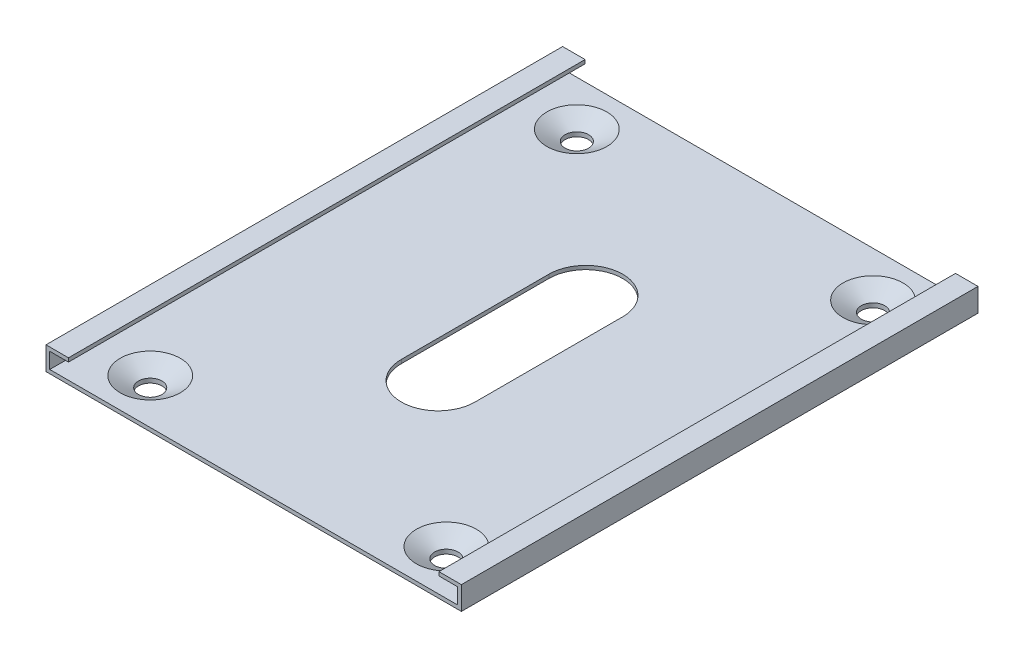
ISO-10303-21;
HEADER;
FILE_DESCRIPTION(('STEP AP214'),'2;1');
FILE_NAME('part.step','',(''),(''),'','','');
FILE_SCHEMA(('AUTOMOTIVE_DESIGN { 1 0 10303 214 1 1 1 1 }'));
ENDSEC;
DATA;
#1=APPLICATION_CONTEXT('core data for automotive mechanical design processes');
#2=APPLICATION_PROTOCOL_DEFINITION('international standard','automotive_design',2000,#1);
#3=PRODUCT_CONTEXT('',#1,'mechanical');
#4=PRODUCT('Part','Part','',(#3));
#5=PRODUCT_RELATED_PRODUCT_CATEGORY('part','',(#4));
#6=PRODUCT_DEFINITION_FORMATION('','',#4);
#7=PRODUCT_DEFINITION_CONTEXT('part definition',#1,'design');
#8=PRODUCT_DEFINITION('design','',#6,#7);
#9=PRODUCT_DEFINITION_SHAPE('','',#8);
#10=(LENGTH_UNIT() NAMED_UNIT(*) SI_UNIT(.MILLI.,.METRE.));
#11=(NAMED_UNIT(*) PLANE_ANGLE_UNIT() SI_UNIT($,.RADIAN.));
#12=(NAMED_UNIT(*) SI_UNIT($,.STERADIAN.) SOLID_ANGLE_UNIT());
#13=UNCERTAINTY_MEASURE_WITH_UNIT(LENGTH_MEASURE(1.E-05),#10,'distance_accuracy_value','');
#14=(GEOMETRIC_REPRESENTATION_CONTEXT(3) GLOBAL_UNCERTAINTY_ASSIGNED_CONTEXT((#13)) GLOBAL_UNIT_ASSIGNED_CONTEXT((#10,
#11,#12)) REPRESENTATION_CONTEXT('',''));
#15=CARTESIAN_POINT('',(0.,0.,0.));
#16=DIRECTION('',(0.,0.,1.));
#17=DIRECTION('',(1.,0.,0.));
#18=AXIS2_PLACEMENT_3D('',#15,#16,#17);
#19=CARTESIAN_POINT('',(-27.6352,2.13359999999999,70.));
#20=DIRECTION('',(0.,1.,0.));
#21=DIRECTION('',(0.,0.,1.));
#22=AXIS2_PLACEMENT_3D('',#19,#20,#21);
#23=PLANE('',#22);
#24=DIRECTION('',(1.,0.,0.));
#25=VECTOR('',#24,1.);
#26=CARTESIAN_POINT('',(-27.6352,2.13359999999999,0.));
#27=LINE('',#26,#25);
#28=CARTESIAN_POINT('',(-27.6352,2.13359999999999,0.));
#29=VERTEX_POINT('',#28);
#30=CARTESIAN_POINT('',(-25.0952,2.13359999999999,0.));
#31=VERTEX_POINT('',#30);
#32=EDGE_CURVE('E172',#29,#31,#27,.T.);
#33=ORIENTED_EDGE('',*,*,#32,.T.);
#34=DIRECTION('',(0.,0.,-1.));
#35=VECTOR('',#34,1.);
#36=CARTESIAN_POINT('',(-25.0952,2.13359999999999,70.));
#37=LINE('',#36,#35);
#38=CARTESIAN_POINT('',(-25.0952,2.13359999999999,70.));
#39=VERTEX_POINT('',#38);
#40=EDGE_CURVE('E229',#39,#31,#37,.T.);
#41=ORIENTED_EDGE('',*,*,#40,.F.);
#42=DIRECTION('',(1.,0.,0.));
#43=VECTOR('',#42,1.);
#44=CARTESIAN_POINT('',(-27.6352,2.13359999999999,70.));
#45=LINE('',#44,#43);
#46=CARTESIAN_POINT('',(-27.6352,2.13359999999999,70.));
#47=VERTEX_POINT('',#46);
#48=EDGE_CURVE('E167',#47,#39,#45,.T.);
#49=ORIENTED_EDGE('',*,*,#48,.F.);
#50=DIRECTION('',(0.,0.,-1.));
#51=VECTOR('',#50,1.);
#52=CARTESIAN_POINT('',(-27.6352,2.13359999999999,70.));
#53=LINE('',#52,#51);
#54=EDGE_CURVE('E162',#47,#29,#53,.T.);
#55=ORIENTED_EDGE('',*,*,#54,.T.);
#56=EDGE_LOOP('',(#33,#41,#49,#55));
#57=FACE_BOUND('',#56,.T.);
#58=ADVANCED_FACE('F33',(#57),#23,.F.);
#59=CARTESIAN_POINT('',(-25.0952,2.64159999999999,70.));
#60=DIRECTION('',(1.,0.,0.));
#61=DIRECTION('',(0.,0.,-1.));
#62=AXIS2_PLACEMENT_3D('',#59,#60,#61);
#63=PLANE('',#62);
#64=DIRECTION('',(0.,-1.,0.));
#65=VECTOR('',#64,1.);
#66=CARTESIAN_POINT('',(-25.0952,2.64159999999999,0.));
#67=LINE('',#66,#65);
#68=CARTESIAN_POINT('',(-25.0952,2.64159999999999,0.));
#69=VERTEX_POINT('',#68);
#70=EDGE_CURVE('E179',#69,#31,#67,.T.);
#71=ORIENTED_EDGE('',*,*,#70,.F.);
#72=DIRECTION('',(0.,0.,-1.));
#73=VECTOR('',#72,1.);
#74=CARTESIAN_POINT('',(-25.0952,2.64159999999999,70.));
#75=LINE('',#74,#73);
#76=CARTESIAN_POINT('',(-25.0952,2.64159999999999,70.));
#77=VERTEX_POINT('',#76);
#78=EDGE_CURVE('E227',#77,#69,#75,.T.);
#79=ORIENTED_EDGE('',*,*,#78,.F.);
#80=DIRECTION('',(0.,-1.,0.));
#81=VECTOR('',#80,1.);
#82=CARTESIAN_POINT('',(-25.0952,2.64159999999999,70.));
#83=LINE('',#82,#81);
#84=EDGE_CURVE('E290',#77,#39,#83,.T.);
#85=ORIENTED_EDGE('',*,*,#84,.T.);
#86=ORIENTED_EDGE('',*,*,#40,.T.);
#87=EDGE_LOOP('',(#71,#79,#85,#86));
#88=FACE_BOUND('',#87,.T.);
#89=ADVANCED_FACE('F321',(#88),#63,.T.);
#90=CARTESIAN_POINT('',(-27.6352,2.64159999999999,70.));
#91=DIRECTION('',(0.,1.,0.));
#92=DIRECTION('',(0.,0.,1.));
#93=AXIS2_PLACEMENT_3D('',#90,#91,#92);
#94=PLANE('',#93);
#95=DIRECTION('',(1.,0.,0.));
#96=VECTOR('',#95,1.);
#97=CARTESIAN_POINT('',(-27.6352,2.64159999999999,0.));
#98=LINE('',#97,#96);
#99=CARTESIAN_POINT('',(-28.1432,2.64159999999999,0.));
#100=VERTEX_POINT('',#99);
#101=EDGE_CURVE('E182',#100,#69,#98,.T.);
#102=ORIENTED_EDGE('',*,*,#101,.F.);
#103=DIRECTION('',(0.,0.,-1.));
#104=VECTOR('',#103,1.);
#105=CARTESIAN_POINT('',(-28.1432,2.64159999999999,70.));
#106=LINE('',#105,#104);
#107=CARTESIAN_POINT('',(-28.1432,2.64159999999999,70.));
#108=VERTEX_POINT('',#107);
#109=EDGE_CURVE('E225',#108,#100,#106,.T.);
#110=ORIENTED_EDGE('',*,*,#109,.F.);
#111=DIRECTION('',(1.,0.,0.));
#112=VECTOR('',#111,1.);
#113=CARTESIAN_POINT('',(-27.6352,2.64159999999999,70.));
#114=LINE('',#113,#112);
#115=EDGE_CURVE('E293',#108,#77,#114,.T.);
#116=ORIENTED_EDGE('',*,*,#115,.T.);
#117=ORIENTED_EDGE('',*,*,#78,.T.);
#118=EDGE_LOOP('',(#102,#110,#116,#117));
#119=FACE_BOUND('',#118,.T.);
#120=ADVANCED_FACE('F324',(#119),#94,.T.);
#121=CARTESIAN_POINT('',(-28.1432,0.,70.));
#122=DIRECTION('',(-1.,0.,0.));
#123=DIRECTION('',(0.,0.,1.));
#124=AXIS2_PLACEMENT_3D('',#121,#122,#123);
#125=PLANE('',#124);
#126=DIRECTION('',(0.,1.,0.));
#127=VECTOR('',#126,1.);
#128=CARTESIAN_POINT('',(-28.1432,0.,0.));
#129=LINE('',#128,#127);
#130=CARTESIAN_POINT('',(-28.1432,-0.508,0.));
#131=VERTEX_POINT('',#130);
#132=EDGE_CURVE('E189',#131,#100,#129,.T.);
#133=ORIENTED_EDGE('',*,*,#132,.F.);
#134=DIRECTION('',(0.,0.,-1.));
#135=VECTOR('',#134,1.);
#136=CARTESIAN_POINT('',(-28.1432,-0.508,70.));
#137=LINE('',#136,#135);
#138=CARTESIAN_POINT('',(-28.1432,-0.508,70.));
#139=VERTEX_POINT('',#138);
#140=EDGE_CURVE('E223',#139,#131,#137,.T.);
#141=ORIENTED_EDGE('',*,*,#140,.F.);
#142=DIRECTION('',(0.,1.,0.));
#143=VECTOR('',#142,1.);
#144=CARTESIAN_POINT('',(-28.1432,0.,70.));
#145=LINE('',#144,#143);
#146=EDGE_CURVE('E296',#139,#108,#145,.T.);
#147=ORIENTED_EDGE('',*,*,#146,.T.);
#148=ORIENTED_EDGE('',*,*,#109,.T.);
#149=EDGE_LOOP('',(#133,#141,#147,#148));
#150=FACE_BOUND('',#149,.T.);
#151=ADVANCED_FACE('F329',(#150),#125,.T.);
#152=CARTESIAN_POINT('',(27.6352,-0.508,70.));
#153=DIRECTION('',(0.,-1.,0.));
#154=DIRECTION('',(0.,0.,-1.));
#155=AXIS2_PLACEMENT_3D('',#152,#153,#154);
#156=PLANE('',#155);
#157=CARTESIAN_POINT('',(-20.1168,-0.508,6.09599999999999));
#158=DIRECTION('',(0.,-1.,0.));
#159=DIRECTION('',(0.,0.,-1.));
#160=AXIS2_PLACEMENT_3D('',#157,#158,#159);
#161=CIRCLE('',#160,4.20011818975501);
#162=CARTESIAN_POINT('',(-20.1168,-0.508,1.89588181024498));
#163=VERTEX_POINT('',#162);
#164=EDGE_CURVE('E521',#163,#163,#161,.F.);
#165=ORIENTED_EDGE('',*,*,#164,.T.);
#166=EDGE_LOOP('',(#165));
#167=FACE_BOUND('',#166,.T.);
#168=CARTESIAN_POINT('',(20.0152,-0.508,6.09599999999999));
#169=DIRECTION('',(0.,-1.,0.));
#170=DIRECTION('',(0.,0.,-1.));
#171=AXIS2_PLACEMENT_3D('',#168,#169,#170);
#172=CIRCLE('',#171,4.20011818975501);
#173=CARTESIAN_POINT('',(20.0152,-0.508,1.89588181024498));
#174=VERTEX_POINT('',#173);
#175=EDGE_CURVE('E246',#174,#174,#172,.F.);
#176=ORIENTED_EDGE('',*,*,#175,.T.);
#177=EDGE_LOOP('',(#176));
#178=FACE_BOUND('',#177,.T.);
#179=CARTESIAN_POINT('',(-20.1168,-0.508,63.904));
#180=DIRECTION('',(0.,-1.,0.));
#181=DIRECTION('',(0.,0.,-1.));
#182=AXIS2_PLACEMENT_3D('',#179,#180,#181);
#183=CIRCLE('',#182,4.20011818975501);
#184=CARTESIAN_POINT('',(-20.1168,-0.508,59.703881810245));
#185=VERTEX_POINT('',#184);
#186=EDGE_CURVE('E269',#185,#185,#183,.F.);
#187=ORIENTED_EDGE('',*,*,#186,.T.);
#188=EDGE_LOOP('',(#187));
#189=FACE_BOUND('',#188,.T.);
#190=CARTESIAN_POINT('',(20.0152,-0.508,63.904));
#191=DIRECTION('',(0.,-1.,0.));
#192=DIRECTION('',(0.,0.,-1.));
#193=AXIS2_PLACEMENT_3D('',#190,#191,#192);
#194=CIRCLE('',#193,4.20011818975501);
#195=CARTESIAN_POINT('',(20.0152,-0.508,59.703881810245));
#196=VERTEX_POINT('',#195);
#197=EDGE_CURVE('E281',#196,#196,#194,.F.);
#198=ORIENTED_EDGE('',*,*,#197,.T.);
#199=EDGE_LOOP('',(#198));
#200=FACE_BOUND('',#199,.T.);
#201=CARTESIAN_POINT('',(0.,-0.508,45.));
#202=DIRECTION('',(0.,-1.,0.));
#203=DIRECTION('',(0.,0.,-1.));
#204=AXIS2_PLACEMENT_3D('',#201,#202,#203);
#205=CIRCLE('',#204,5.);
#206=CARTESIAN_POINT('',(4.99999999999999,-0.508,45.));
#207=VERTEX_POINT('',#206);
#208=CARTESIAN_POINT('',(-5.,-0.508,45.));
#209=VERTEX_POINT('',#208);
#210=EDGE_CURVE('E180',#207,#209,#205,.T.);
#211=ORIENTED_EDGE('',*,*,#210,.F.);
#212=DIRECTION('',(0.,0.,-1.));
#213=VECTOR('',#212,1.);
#214=CARTESIAN_POINT('',(4.99999999999999,-0.508,45.));
#215=LINE('',#214,#213);
#216=CARTESIAN_POINT('',(5.00000000000001,-0.508,25.));
#217=VERTEX_POINT('',#216);
#218=EDGE_CURVE('E78',#217,#207,#215,.F.);
#219=ORIENTED_EDGE('',*,*,#218,.F.);
#220=CARTESIAN_POINT('',(0.,-0.508,25.));
#221=DIRECTION('',(0.,-1.,0.));
#222=DIRECTION('',(0.,0.,-1.));
#223=AXIS2_PLACEMENT_3D('',#220,#221,#222);
#224=CIRCLE('',#223,5.);
#225=CARTESIAN_POINT('',(-4.99999999999999,-0.508,25.));
#226=VERTEX_POINT('',#225);
#227=EDGE_CURVE('E241',#226,#217,#224,.T.);
#228=ORIENTED_EDGE('',*,*,#227,.F.);
#229=DIRECTION('',(0.,0.,1.));
#230=VECTOR('',#229,1.);
#231=CARTESIAN_POINT('',(-5.,-0.508,45.));
#232=LINE('',#231,#230);
#233=EDGE_CURVE('E239',#209,#226,#232,.F.);
#234=ORIENTED_EDGE('',*,*,#233,.F.);
#235=EDGE_LOOP('',(#211,#219,#228,#234));
#236=FACE_BOUND('',#235,.T.);
#237=DIRECTION('',(1.,0.,0.));
#238=VECTOR('',#237,1.);
#239=CARTESIAN_POINT('',(27.6352,-0.508,0.));
#240=LINE('',#239,#238);
#241=CARTESIAN_POINT('',(28.1432,-0.508,0.));
#242=VERTEX_POINT('',#241);
#243=EDGE_CURVE('E192',#242,#131,#240,.F.);
#244=ORIENTED_EDGE('',*,*,#243,.F.);
#245=DIRECTION('',(0.,0.,-1.));
#246=VECTOR('',#245,1.);
#247=CARTESIAN_POINT('',(28.1432,-0.508,70.));
#248=LINE('',#247,#246);
#249=CARTESIAN_POINT('',(28.1432,-0.508,70.));
#250=VERTEX_POINT('',#249);
#251=EDGE_CURVE('E221',#250,#242,#248,.T.);
#252=ORIENTED_EDGE('',*,*,#251,.F.);
#253=DIRECTION('',(1.,0.,0.));
#254=VECTOR('',#253,1.);
#255=CARTESIAN_POINT('',(27.6352,-0.508,70.));
#256=LINE('',#255,#254);
#257=EDGE_CURVE('E299',#250,#139,#256,.F.);
#258=ORIENTED_EDGE('',*,*,#257,.T.);
#259=ORIENTED_EDGE('',*,*,#140,.T.);
#260=EDGE_LOOP('',(#244,#252,#258,#259));
#261=FACE_BOUND('',#260,.T.);
#262=ADVANCED_FACE('F332',(#167,#178,#189,#200,#236,#261),#156,.T.);
#263=CARTESIAN_POINT('',(28.1432,0.,70.));
#264=DIRECTION('',(1.,0.,0.));
#265=DIRECTION('',(0.,0.,-1.));
#266=AXIS2_PLACEMENT_3D('',#263,#264,#265);
#267=PLANE('',#266);
#268=DIRECTION('',(0.,1.,0.));
#269=VECTOR('',#268,1.);
#270=CARTESIAN_POINT('',(28.1432,0.,0.));
#271=LINE('',#270,#269);
#272=CARTESIAN_POINT('',(28.1432,2.64159999999999,0.));
#273=VERTEX_POINT('',#272);
#274=EDGE_CURVE('E195',#273,#242,#271,.F.);
#275=ORIENTED_EDGE('',*,*,#274,.F.);
#276=DIRECTION('',(0.,0.,-1.));
#277=VECTOR('',#276,1.);
#278=CARTESIAN_POINT('',(28.1432,2.64159999999999,70.));
#279=LINE('',#278,#277);
#280=CARTESIAN_POINT('',(28.1432,2.64159999999999,70.));
#281=VERTEX_POINT('',#280);
#282=EDGE_CURVE('E219',#281,#273,#279,.T.);
#283=ORIENTED_EDGE('',*,*,#282,.F.);
#284=DIRECTION('',(0.,1.,0.));
#285=VECTOR('',#284,1.);
#286=CARTESIAN_POINT('',(28.1432,0.,70.));
#287=LINE('',#286,#285);
#288=EDGE_CURVE('E302',#281,#250,#287,.F.);
#289=ORIENTED_EDGE('',*,*,#288,.T.);
#290=ORIENTED_EDGE('',*,*,#251,.T.);
#291=EDGE_LOOP('',(#275,#283,#289,#290));
#292=FACE_BOUND('',#291,.T.);
#293=ADVANCED_FACE('F337',(#292),#267,.T.);
#294=CARTESIAN_POINT('',(27.6352,2.64159999999999,70.));
#295=DIRECTION('',(0.,1.,0.));
#296=DIRECTION('',(0.,0.,1.));
#297=AXIS2_PLACEMENT_3D('',#294,#295,#296);
#298=PLANE('',#297);
#299=DIRECTION('',(1.,0.,0.));
#300=VECTOR('',#299,1.);
#301=CARTESIAN_POINT('',(27.6352,2.64159999999999,0.));
#302=LINE('',#301,#300);
#303=CARTESIAN_POINT('',(25.0952,2.64159999999999,0.));
#304=VERTEX_POINT('',#303);
#305=EDGE_CURVE('E198',#304,#273,#302,.T.);
#306=ORIENTED_EDGE('',*,*,#305,.F.);
#307=DIRECTION('',(0.,0.,-1.));
#308=VECTOR('',#307,1.);
#309=CARTESIAN_POINT('',(25.0952,2.64159999999999,70.));
#310=LINE('',#309,#308);
#311=CARTESIAN_POINT('',(25.0952,2.64159999999999,70.));
#312=VERTEX_POINT('',#311);
#313=EDGE_CURVE('E217',#312,#304,#310,.T.);
#314=ORIENTED_EDGE('',*,*,#313,.F.);
#315=DIRECTION('',(1.,0.,0.));
#316=VECTOR('',#315,1.);
#317=CARTESIAN_POINT('',(27.6352,2.64159999999999,70.));
#318=LINE('',#317,#316);
#319=EDGE_CURVE('E305',#312,#281,#318,.T.);
#320=ORIENTED_EDGE('',*,*,#319,.T.);
#321=ORIENTED_EDGE('',*,*,#282,.T.);
#322=EDGE_LOOP('',(#306,#314,#320,#321));
#323=FACE_BOUND('',#322,.T.);
#324=ADVANCED_FACE('F340',(#323),#298,.T.);
#325=CARTESIAN_POINT('',(25.0952,2.13359999999999,70.));
#326=DIRECTION('',(-1.,0.,0.));
#327=DIRECTION('',(0.,0.,1.));
#328=AXIS2_PLACEMENT_3D('',#325,#326,#327);
#329=PLANE('',#328);
#330=DIRECTION('',(0.,1.,0.));
#331=VECTOR('',#330,1.);
#332=CARTESIAN_POINT('',(25.0952,2.13359999999999,0.));
#333=LINE('',#332,#331);
#334=CARTESIAN_POINT('',(25.0952,2.13359999999999,0.));
#335=VERTEX_POINT('',#334);
#336=EDGE_CURVE('E201',#335,#304,#333,.T.);
#337=ORIENTED_EDGE('',*,*,#336,.F.);
#338=DIRECTION('',(0.,0.,-1.));
#339=VECTOR('',#338,1.);
#340=CARTESIAN_POINT('',(25.0952,2.13359999999999,70.));
#341=LINE('',#340,#339);
#342=CARTESIAN_POINT('',(25.0952,2.13359999999999,70.));
#343=VERTEX_POINT('',#342);
#344=EDGE_CURVE('E215',#343,#335,#341,.T.);
#345=ORIENTED_EDGE('',*,*,#344,.F.);
#346=DIRECTION('',(0.,1.,0.));
#347=VECTOR('',#346,1.);
#348=CARTESIAN_POINT('',(25.0952,2.13359999999999,70.));
#349=LINE('',#348,#347);
#350=EDGE_CURVE('E308',#343,#312,#349,.T.);
#351=ORIENTED_EDGE('',*,*,#350,.T.);
#352=ORIENTED_EDGE('',*,*,#313,.T.);
#353=EDGE_LOOP('',(#337,#345,#351,#352));
#354=FACE_BOUND('',#353,.T.);
#355=ADVANCED_FACE('F344',(#354),#329,.T.);
#356=CARTESIAN_POINT('',(27.6352,2.13359999999999,70.));
#357=DIRECTION('',(0.,1.,0.));
#358=DIRECTION('',(0.,0.,1.));
#359=AXIS2_PLACEMENT_3D('',#356,#357,#358);
#360=PLANE('',#359);
#361=DIRECTION('',(1.,0.,0.));
#362=VECTOR('',#361,1.);
#363=CARTESIAN_POINT('',(27.6352,2.13359999999999,0.));
#364=LINE('',#363,#362);
#365=CARTESIAN_POINT('',(27.6352,2.13359999999999,0.));
#366=VERTEX_POINT('',#365);
#367=EDGE_CURVE('E204',#335,#366,#364,.T.);
#368=ORIENTED_EDGE('',*,*,#367,.T.);
#369=DIRECTION('',(0.,0.,-1.));
#370=VECTOR('',#369,1.);
#371=CARTESIAN_POINT('',(27.6352,2.13359999999999,70.));
#372=LINE('',#371,#370);
#373=CARTESIAN_POINT('',(27.6352,2.13359999999999,70.));
#374=VERTEX_POINT('',#373);
#375=EDGE_CURVE('E212',#374,#366,#372,.T.);
#376=ORIENTED_EDGE('',*,*,#375,.F.);
#377=DIRECTION('',(1.,0.,0.));
#378=VECTOR('',#377,1.);
#379=CARTESIAN_POINT('',(27.6352,2.13359999999999,70.));
#380=LINE('',#379,#378);
#381=EDGE_CURVE('E311',#343,#374,#380,.T.);
#382=ORIENTED_EDGE('',*,*,#381,.F.);
#383=ORIENTED_EDGE('',*,*,#344,.T.);
#384=EDGE_LOOP('',(#368,#376,#382,#383));
#385=FACE_BOUND('',#384,.T.);
#386=ADVANCED_FACE('F349',(#385),#360,.F.);
#387=CARTESIAN_POINT('',(27.6352,0.,70.));
#388=DIRECTION('',(1.,0.,0.));
#389=DIRECTION('',(0.,0.,-1.));
#390=AXIS2_PLACEMENT_3D('',#387,#388,#389);
#391=PLANE('',#390);
#392=DIRECTION('',(0.,-1.,0.));
#393=VECTOR('',#392,1.);
#394=CARTESIAN_POINT('',(27.6352,0.,0.));
#395=LINE('',#394,#393);
#396=CARTESIAN_POINT('',(27.6352,0.,0.));
#397=VERTEX_POINT('',#396);
#398=EDGE_CURVE('E206',#366,#397,#395,.T.);
#399=ORIENTED_EDGE('',*,*,#398,.T.);
#400=DIRECTION('',(0.,0.,-1.));
#401=VECTOR('',#400,1.);
#402=CARTESIAN_POINT('',(27.6352,0.,70.));
#403=LINE('',#402,#401);
#404=CARTESIAN_POINT('',(27.6352,0.,70.));
#405=VERTEX_POINT('',#404);
#406=EDGE_CURVE('E210',#405,#397,#403,.T.);
#407=ORIENTED_EDGE('',*,*,#406,.F.);
#408=DIRECTION('',(0.,-1.,0.));
#409=VECTOR('',#408,1.);
#410=CARTESIAN_POINT('',(27.6352,0.,70.));
#411=LINE('',#410,#409);
#412=EDGE_CURVE('E313',#374,#405,#411,.T.);
#413=ORIENTED_EDGE('',*,*,#412,.F.);
#414=ORIENTED_EDGE('',*,*,#375,.T.);
#415=EDGE_LOOP('',(#399,#407,#413,#414));
#416=FACE_BOUND('',#415,.T.);
#417=ADVANCED_FACE('F353',(#416),#391,.F.);
#418=CARTESIAN_POINT('',(27.6352,0.,70.));
#419=DIRECTION('',(0.,-1.,0.));
#420=DIRECTION('',(0.,0.,-1.));
#421=AXIS2_PLACEMENT_3D('',#418,#419,#420);
#422=PLANE('',#421);
#423=DIRECTION('',(0.,0.,1.));
#424=VECTOR('',#423,1.);
#425=CARTESIAN_POINT('',(4.99999999999997,0.,70.));
#426=LINE('',#425,#424);
#427=CARTESIAN_POINT('',(5.00000000000001,0.,25.));
#428=VERTEX_POINT('',#427);
#429=CARTESIAN_POINT('',(4.99999999999999,0.,45.));
#430=VERTEX_POINT('',#429);
#431=EDGE_CURVE('E41',#428,#430,#426,.T.);
#432=ORIENTED_EDGE('',*,*,#431,.T.);
#433=CARTESIAN_POINT('',(0.,0.,45.));
#434=DIRECTION('',(0.,-1.,0.));
#435=DIRECTION('',(0.,0.,-1.));
#436=AXIS2_PLACEMENT_3D('',#433,#434,#435);
#437=CIRCLE('',#436,5.);
#438=CARTESIAN_POINT('',(-5.,0.,45.));
#439=VERTEX_POINT('',#438);
#440=EDGE_CURVE('E11',#430,#439,#437,.T.);
#441=ORIENTED_EDGE('',*,*,#440,.T.);
#442=DIRECTION('',(0.,0.,-1.));
#443=VECTOR('',#442,1.);
#444=CARTESIAN_POINT('',(-5.00000000000002,0.,70.));
#445=LINE('',#444,#443);
#446=CARTESIAN_POINT('',(-4.99999999999999,0.,25.));
#447=VERTEX_POINT('',#446);
#448=EDGE_CURVE('E231',#439,#447,#445,.T.);
#449=ORIENTED_EDGE('',*,*,#448,.T.);
#450=CARTESIAN_POINT('',(0.,0.,25.));
#451=DIRECTION('',(0.,-1.,0.));
#452=DIRECTION('',(0.,0.,-1.));
#453=AXIS2_PLACEMENT_3D('',#450,#451,#452);
#454=CIRCLE('',#453,5.);
#455=EDGE_CURVE('E234',#447,#428,#454,.T.);
#456=ORIENTED_EDGE('',*,*,#455,.T.);
#457=EDGE_LOOP('',(#432,#441,#449,#456));
#458=FACE_BOUND('',#457,.T.);
#459=DIRECTION('',(-1.,0.,0.));
#460=VECTOR('',#459,1.);
#461=CARTESIAN_POINT('',(27.6352,0.,0.));
#462=LINE('',#461,#460);
#463=CARTESIAN_POINT('',(-27.6352,0.,0.));
#464=VERTEX_POINT('',#463);
#465=EDGE_CURVE('E152',#397,#464,#462,.T.);
#466=ORIENTED_EDGE('',*,*,#465,.T.);
#467=DIRECTION('',(0.,0.,-1.));
#468=VECTOR('',#467,1.);
#469=CARTESIAN_POINT('',(-27.6352,0.,70.));
#470=LINE('',#469,#468);
#471=CARTESIAN_POINT('',(-27.6352,0.,70.));
#472=VERTEX_POINT('',#471);
#473=EDGE_CURVE('E164',#472,#464,#470,.T.);
#474=ORIENTED_EDGE('',*,*,#473,.F.);
#475=DIRECTION('',(-1.,0.,0.));
#476=VECTOR('',#475,1.);
#477=CARTESIAN_POINT('',(27.6352,0.,70.));
#478=LINE('',#477,#476);
#479=EDGE_CURVE('E314',#405,#472,#478,.T.);
#480=ORIENTED_EDGE('',*,*,#479,.F.);
#481=ORIENTED_EDGE('',*,*,#406,.T.);
#482=EDGE_LOOP('',(#466,#474,#480,#481));
#483=FACE_BOUND('',#482,.T.);
#484=CARTESIAN_POINT('',(20.0152,0.,63.904));
#485=DIRECTION('',(0.,1.,0.));
#486=DIRECTION('',(0.,0.,1.));
#487=AXIS2_PLACEMENT_3D('',#484,#485,#486);
#488=CIRCLE('',#487,4.064);
#489=CARTESIAN_POINT('',(20.0152,0.,67.968));
#490=VERTEX_POINT('',#489);
#491=EDGE_CURVE('E278',#490,#490,#488,.T.);
#492=ORIENTED_EDGE('',*,*,#491,.F.);
#493=EDGE_LOOP('',(#492));
#494=FACE_BOUND('',#493,.T.);
#495=CARTESIAN_POINT('',(-20.1168,0.,63.904));
#496=DIRECTION('',(0.,1.,0.));
#497=DIRECTION('',(0.,0.,1.));
#498=AXIS2_PLACEMENT_3D('',#495,#496,#497);
#499=CIRCLE('',#498,4.064);
#500=CARTESIAN_POINT('',(-20.1168,0.,67.968));
#501=VERTEX_POINT('',#500);
#502=EDGE_CURVE('E266',#501,#501,#499,.T.);
#503=ORIENTED_EDGE('',*,*,#502,.F.);
#504=EDGE_LOOP('',(#503));
#505=FACE_BOUND('',#504,.T.);
#506=CARTESIAN_POINT('',(20.0152,0.,6.09599999999999));
#507=DIRECTION('',(0.,-1.,0.));
#508=DIRECTION('',(0.,0.,-1.));
#509=AXIS2_PLACEMENT_3D('',#506,#507,#508);
#510=CIRCLE('',#509,4.064);
#511=CARTESIAN_POINT('',(20.0152,0.,2.03199999999999));
#512=VERTEX_POINT('',#511);
#513=EDGE_CURVE('E36',#512,#512,#510,.F.);
#514=ORIENTED_EDGE('',*,*,#513,.F.);
#515=EDGE_LOOP('',(#514));
#516=FACE_BOUND('',#515,.T.);
#517=CARTESIAN_POINT('',(-20.1168,0.,6.09599999999999));
#518=DIRECTION('',(0.,-1.,0.));
#519=DIRECTION('',(0.,0.,-1.));
#520=AXIS2_PLACEMENT_3D('',#517,#518,#519);
#521=CIRCLE('',#520,4.064);
#522=CARTESIAN_POINT('',(-20.1168,0.,2.03199999999999));
#523=VERTEX_POINT('',#522);
#524=EDGE_CURVE('E244',#523,#523,#521,.F.);
#525=ORIENTED_EDGE('',*,*,#524,.F.);
#526=EDGE_LOOP('',(#525));
#527=FACE_BOUND('',#526,.T.);
#528=ADVANCED_FACE('F355',(#458,#483,#494,#505,#516,#527),#422,.F.);
#529=CARTESIAN_POINT('',(-27.6352,0.,70.));
#530=DIRECTION('',(-1.,0.,0.));
#531=DIRECTION('',(0.,0.,1.));
#532=AXIS2_PLACEMENT_3D('',#529,#530,#531);
#533=PLANE('',#532);
#534=DIRECTION('',(0.,1.,0.));
#535=VECTOR('',#534,1.);
#536=CARTESIAN_POINT('',(-27.6352,0.,0.));
#537=LINE('',#536,#535);
#538=EDGE_CURVE('E158',#464,#29,#537,.T.);
#539=ORIENTED_EDGE('',*,*,#538,.T.);
#540=ORIENTED_EDGE('',*,*,#54,.F.);
#541=DIRECTION('',(0.,1.,0.));
#542=VECTOR('',#541,1.);
#543=CARTESIAN_POINT('',(-27.6352,0.,70.));
#544=LINE('',#543,#542);
#545=EDGE_CURVE('E174',#472,#47,#544,.T.);
#546=ORIENTED_EDGE('',*,*,#545,.F.);
#547=ORIENTED_EDGE('',*,*,#473,.T.);
#548=EDGE_LOOP('',(#539,#540,#546,#547));
#549=FACE_BOUND('',#548,.T.);
#550=ADVANCED_FACE('F160',(#549),#533,.F.);
#551=CARTESIAN_POINT('',(0.,0.,70.));
#552=DIRECTION('',(0.,0.,-1.));
#553=DIRECTION('',(-1.,0.,0.));
#554=AXIS2_PLACEMENT_3D('',#551,#552,#553);
#555=PLANE('',#554);
#556=ORIENTED_EDGE('',*,*,#48,.T.);
#557=ORIENTED_EDGE('',*,*,#84,.F.);
#558=ORIENTED_EDGE('',*,*,#115,.F.);
#559=ORIENTED_EDGE('',*,*,#146,.F.);
#560=ORIENTED_EDGE('',*,*,#257,.F.);
#561=ORIENTED_EDGE('',*,*,#288,.F.);
#562=ORIENTED_EDGE('',*,*,#319,.F.);
#563=ORIENTED_EDGE('',*,*,#350,.F.);
#564=ORIENTED_EDGE('',*,*,#381,.T.);
#565=ORIENTED_EDGE('',*,*,#412,.T.);
#566=ORIENTED_EDGE('',*,*,#479,.T.);
#567=ORIENTED_EDGE('',*,*,#545,.T.);
#568=EDGE_LOOP('',(#556,#557,#558,#559,#560,#561,#562,#563,#564,#565,#566,#567));
#569=FACE_BOUND('',#568,.T.);
#570=ADVANCED_FACE('F317',(#569),#555,.F.);
#571=CARTESIAN_POINT('',(0.,0.,0.));
#572=DIRECTION('',(0.,0.,-1.));
#573=DIRECTION('',(-1.,0.,0.));
#574=AXIS2_PLACEMENT_3D('',#571,#572,#573);
#575=PLANE('',#574);
#576=ORIENTED_EDGE('',*,*,#32,.F.);
#577=ORIENTED_EDGE('',*,*,#538,.F.);
#578=ORIENTED_EDGE('',*,*,#465,.F.);
#579=ORIENTED_EDGE('',*,*,#398,.F.);
#580=ORIENTED_EDGE('',*,*,#367,.F.);
#581=ORIENTED_EDGE('',*,*,#336,.T.);
#582=ORIENTED_EDGE('',*,*,#305,.T.);
#583=ORIENTED_EDGE('',*,*,#274,.T.);
#584=ORIENTED_EDGE('',*,*,#243,.T.);
#585=ORIENTED_EDGE('',*,*,#132,.T.);
#586=ORIENTED_EDGE('',*,*,#101,.T.);
#587=ORIENTED_EDGE('',*,*,#70,.T.);
#588=EDGE_LOOP('',(#576,#577,#578,#579,#580,#581,#582,#583,#584,#585,#586,#587));
#589=FACE_BOUND('',#588,.T.);
#590=ADVANCED_FACE('F176',(#589),#575,.T.);
#591=CARTESIAN_POINT('',(0.,2.64159999999999,45.));
#592=DIRECTION('',(0.,-1.,0.));
#593=DIRECTION('',(0.,0.,-1.));
#594=AXIS2_PLACEMENT_3D('',#591,#592,#593);
#595=CYLINDRICAL_SURFACE('',#594,5.);
#596=ORIENTED_EDGE('',*,*,#210,.T.);
#597=DIRECTION('',(0.,-1.,0.));
#598=VECTOR('',#597,1.);
#599=CARTESIAN_POINT('',(-5.,2.64159999999999,45.));
#600=LINE('',#599,#598);
#601=EDGE_CURVE('E49',#439,#209,#600,.T.);
#602=ORIENTED_EDGE('',*,*,#601,.F.);
#603=ORIENTED_EDGE('',*,*,#440,.F.);
#604=DIRECTION('',(0.,-1.,0.));
#605=VECTOR('',#604,1.);
#606=CARTESIAN_POINT('',(4.99999999999999,2.64159999999999,45.));
#607=LINE('',#606,#605);
#608=EDGE_CURVE('E242',#430,#207,#607,.T.);
#609=ORIENTED_EDGE('',*,*,#608,.T.);
#610=EDGE_LOOP('',(#596,#602,#603,#609));
#611=FACE_BOUND('',#610,.T.);
#612=ADVANCED_FACE('F411',(#611),#595,.F.);
#613=CARTESIAN_POINT('',(4.99999999999999,2.64159999999999,45.));
#614=DIRECTION('',(1.,0.,0.));
#615=DIRECTION('',(0.,0.,-1.));
#616=AXIS2_PLACEMENT_3D('',#613,#614,#615);
#617=PLANE('',#616);
#618=ORIENTED_EDGE('',*,*,#218,.T.);
#619=ORIENTED_EDGE('',*,*,#608,.F.);
#620=ORIENTED_EDGE('',*,*,#431,.F.);
#621=DIRECTION('',(0.,-1.,0.));
#622=VECTOR('',#621,1.);
#623=CARTESIAN_POINT('',(5.00000000000001,2.64159999999999,25.));
#624=LINE('',#623,#622);
#625=EDGE_CURVE('E284',#428,#217,#624,.T.);
#626=ORIENTED_EDGE('',*,*,#625,.T.);
#627=EDGE_LOOP('',(#618,#619,#620,#626));
#628=FACE_BOUND('',#627,.T.);
#629=ADVANCED_FACE('F416',(#628),#617,.F.);
#630=CARTESIAN_POINT('',(0.,2.64159999999999,25.));
#631=DIRECTION('',(0.,-1.,0.));
#632=DIRECTION('',(0.,0.,-1.));
#633=AXIS2_PLACEMENT_3D('',#630,#631,#632);
#634=CYLINDRICAL_SURFACE('',#633,5.);
#635=ORIENTED_EDGE('',*,*,#227,.T.);
#636=ORIENTED_EDGE('',*,*,#625,.F.);
#637=ORIENTED_EDGE('',*,*,#455,.F.);
#638=DIRECTION('',(0.,-1.,0.));
#639=VECTOR('',#638,1.);
#640=CARTESIAN_POINT('',(-4.99999999999999,2.64159999999999,25.));
#641=LINE('',#640,#639);
#642=EDGE_CURVE('E55',#447,#226,#641,.T.);
#643=ORIENTED_EDGE('',*,*,#642,.T.);
#644=EDGE_LOOP('',(#635,#636,#637,#643));
#645=FACE_BOUND('',#644,.T.);
#646=ADVANCED_FACE('F421',(#645),#634,.F.);
#647=CARTESIAN_POINT('',(-5.,2.64159999999999,45.));
#648=DIRECTION('',(-1.,0.,0.));
#649=DIRECTION('',(0.,0.,1.));
#650=AXIS2_PLACEMENT_3D('',#647,#648,#649);
#651=PLANE('',#650);
#652=ORIENTED_EDGE('',*,*,#233,.T.);
#653=ORIENTED_EDGE('',*,*,#642,.F.);
#654=ORIENTED_EDGE('',*,*,#448,.F.);
#655=ORIENTED_EDGE('',*,*,#601,.T.);
#656=EDGE_LOOP('',(#652,#653,#654,#655));
#657=FACE_BOUND('',#656,.T.);
#658=ADVANCED_FACE('F417',(#657),#651,.F.);
#659=CARTESIAN_POINT('',(20.0152,0.,63.904));
#660=DIRECTION('',(0.,1.,0.));
#661=DIRECTION('',(0.,0.,1.));
#662=AXIS2_PLACEMENT_3D('',#659,#660,#661);
#663=CONICAL_SURFACE('',#662,4.064,1.0471975511966);
#664=CARTESIAN_POINT('',(20.0152,-1.4298079416481,63.904));
#665=DIRECTION('',(0.,1.,0.));
#666=DIRECTION('',(0.,0.,1.));
#667=AXIS2_PLACEMENT_3D('',#664,#665,#666);
#668=CIRCLE('',#667,1.5875);
#669=CARTESIAN_POINT('',(20.0152,-1.4298079416481,65.4915));
#670=VERTEX_POINT('',#669);
#671=EDGE_CURVE('E275',#670,#670,#668,.T.);
#672=ORIENTED_EDGE('',*,*,#671,.F.);
#673=EDGE_LOOP('',(#672));
#674=FACE_BOUND('',#673,.T.);
#675=ORIENTED_EDGE('',*,*,#491,.T.);
#676=EDGE_LOOP('',(#675));
#677=FACE_BOUND('',#676,.T.);
#678=ADVANCED_FACE('F420',(#674,#677),#663,.F.);
#679=CARTESIAN_POINT('',(20.0152,10.1098877683464,63.904));
#680=DIRECTION('',(0.,1.,0.));
#681=DIRECTION('',(0.,0.,1.));
#682=AXIS2_PLACEMENT_3D('',#679,#680,#681);
#683=CYLINDRICAL_SURFACE('',#682,1.5875);
#684=CARTESIAN_POINT('',(20.0152,-2.01639581514476,63.904));
#685=DIRECTION('',(0.,1.,0.));
#686=DIRECTION('',(0.,0.,1.));
#687=AXIS2_PLACEMENT_3D('',#684,#685,#686);
#688=CIRCLE('',#687,1.5875);
#689=CARTESIAN_POINT('',(20.0152,-2.01639581514476,65.4915));
#690=VERTEX_POINT('',#689);
#691=EDGE_CURVE('E272',#690,#690,#688,.T.);
#692=ORIENTED_EDGE('',*,*,#691,.F.);
#693=EDGE_LOOP('',(#692));
#694=FACE_BOUND('',#693,.T.);
#695=ORIENTED_EDGE('',*,*,#671,.T.);
#696=EDGE_LOOP('',(#695));
#697=FACE_BOUND('',#696,.T.);
#698=ADVANCED_FACE('F429',(#694,#697),#683,.F.);
#699=CARTESIAN_POINT('',(20.0152,-2.01639581514476,63.904));
#700=DIRECTION('',(0.,1.,0.));
#701=DIRECTION('',(0.,0.,1.));
#702=AXIS2_PLACEMENT_3D('',#699,#700,#701);
#703=CONICAL_SURFACE('',#702,1.5875,1.0471975511966);
#704=ORIENTED_EDGE('',*,*,#197,.F.);
#705=EDGE_LOOP('',(#704));
#706=FACE_BOUND('',#705,.T.);
#707=ORIENTED_EDGE('',*,*,#691,.T.);
#708=EDGE_LOOP('',(#707));
#709=FACE_BOUND('',#708,.T.);
#710=ADVANCED_FACE('F433',(#706,#709),#703,.T.);
#711=CARTESIAN_POINT('',(-20.1168,0.,63.904));
#712=DIRECTION('',(0.,1.,0.));
#713=DIRECTION('',(0.,0.,1.));
#714=AXIS2_PLACEMENT_3D('',#711,#712,#713);
#715=CONICAL_SURFACE('',#714,4.064,1.0471975511966);
#716=CARTESIAN_POINT('',(-20.1168,-1.4298079416481,63.904));
#717=DIRECTION('',(0.,1.,0.));
#718=DIRECTION('',(0.,0.,1.));
#719=AXIS2_PLACEMENT_3D('',#716,#717,#718);
#720=CIRCLE('',#719,1.5875);
#721=CARTESIAN_POINT('',(-20.1168,-1.4298079416481,65.4915));
#722=VERTEX_POINT('',#721);
#723=EDGE_CURVE('E263',#722,#722,#720,.T.);
#724=ORIENTED_EDGE('',*,*,#723,.F.);
#725=EDGE_LOOP('',(#724));
#726=FACE_BOUND('',#725,.T.);
#727=ORIENTED_EDGE('',*,*,#502,.T.);
#728=EDGE_LOOP('',(#727));
#729=FACE_BOUND('',#728,.T.);
#730=ADVANCED_FACE('F437',(#726,#729),#715,.F.);
#731=CARTESIAN_POINT('',(-20.1168,10.1098877683464,63.904));
#732=DIRECTION('',(0.,1.,0.));
#733=DIRECTION('',(0.,0.,1.));
#734=AXIS2_PLACEMENT_3D('',#731,#732,#733);
#735=CYLINDRICAL_SURFACE('',#734,1.5875);
#736=CARTESIAN_POINT('',(-20.1168,-2.01639581514476,63.904));
#737=DIRECTION('',(0.,1.,0.));
#738=DIRECTION('',(0.,0.,1.));
#739=AXIS2_PLACEMENT_3D('',#736,#737,#738);
#740=CIRCLE('',#739,1.5875);
#741=CARTESIAN_POINT('',(-20.1168,-2.01639581514476,65.4915));
#742=VERTEX_POINT('',#741);
#743=EDGE_CURVE('E250',#742,#742,#740,.T.);
#744=ORIENTED_EDGE('',*,*,#743,.F.);
#745=EDGE_LOOP('',(#744));
#746=FACE_BOUND('',#745,.T.);
#747=ORIENTED_EDGE('',*,*,#723,.T.);
#748=EDGE_LOOP('',(#747));
#749=FACE_BOUND('',#748,.T.);
#750=ADVANCED_FACE('F380',(#746,#749),#735,.F.);
#751=CARTESIAN_POINT('',(-20.1168,-2.01639581514476,63.904));
#752=DIRECTION('',(0.,1.,0.));
#753=DIRECTION('',(0.,0.,1.));
#754=AXIS2_PLACEMENT_3D('',#751,#752,#753);
#755=CONICAL_SURFACE('',#754,1.5875,1.0471975511966);
#756=ORIENTED_EDGE('',*,*,#186,.F.);
#757=EDGE_LOOP('',(#756));
#758=FACE_BOUND('',#757,.T.);
#759=ORIENTED_EDGE('',*,*,#743,.T.);
#760=EDGE_LOOP('',(#759));
#761=FACE_BOUND('',#760,.T.);
#762=ADVANCED_FACE('F370',(#758,#761),#755,.T.);
#763=CARTESIAN_POINT('',(20.0152,0.,6.09599999999999));
#764=DIRECTION('',(0.,1.,0.));
#765=DIRECTION('',(0.,0.,-1.));
#766=AXIS2_PLACEMENT_3D('',#763,#764,#765);
#767=CONICAL_SURFACE('',#766,4.064,1.0471975511966);
#768=CARTESIAN_POINT('',(20.0152,-1.4298079416481,6.09599999999999));
#769=DIRECTION('',(0.,-1.,0.));
#770=DIRECTION('',(0.,0.,-1.));
#771=AXIS2_PLACEMENT_3D('',#768,#769,#770);
#772=CIRCLE('',#771,1.5875);
#773=CARTESIAN_POINT('',(20.0152,-1.4298079416481,4.50849999999999));
#774=VERTEX_POINT('',#773);
#775=EDGE_CURVE('E252',#774,#774,#772,.T.);
#776=ORIENTED_EDGE('',*,*,#775,.T.);
#777=EDGE_LOOP('',(#776));
#778=FACE_BOUND('',#777,.T.);
#779=ORIENTED_EDGE('',*,*,#513,.T.);
#780=EDGE_LOOP('',(#779));
#781=FACE_BOUND('',#780,.T.);
#782=ADVANCED_FACE('F367',(#778,#781),#767,.F.);
#783=CARTESIAN_POINT('',(20.0152,10.1098877683464,6.09599999999999));
#784=DIRECTION('',(0.,1.,0.));
#785=DIRECTION('',(0.,0.,-1.));
#786=AXIS2_PLACEMENT_3D('',#783,#784,#785);
#787=CYLINDRICAL_SURFACE('',#786,1.5875);
#788=CARTESIAN_POINT('',(20.0152,-2.01639581514476,6.09599999999999));
#789=DIRECTION('',(0.,-1.,0.));
#790=DIRECTION('',(0.,0.,-1.));
#791=AXIS2_PLACEMENT_3D('',#788,#789,#790);
#792=CIRCLE('',#791,1.5875);
#793=CARTESIAN_POINT('',(20.0152,-2.01639581514476,4.50849999999999));
#794=VERTEX_POINT('',#793);
#795=EDGE_CURVE('E257',#794,#794,#792,.T.);
#796=ORIENTED_EDGE('',*,*,#795,.T.);
#797=EDGE_LOOP('',(#796));
#798=FACE_BOUND('',#797,.T.);
#799=ORIENTED_EDGE('',*,*,#775,.F.);
#800=EDGE_LOOP('',(#799));
#801=FACE_BOUND('',#800,.T.);
#802=ADVANCED_FACE('F369',(#798,#801),#787,.F.);
#803=CARTESIAN_POINT('',(20.0152,-2.01639581514476,6.09599999999999));
#804=DIRECTION('',(0.,1.,0.));
#805=DIRECTION('',(0.,0.,-1.));
#806=AXIS2_PLACEMENT_3D('',#803,#804,#805);
#807=CONICAL_SURFACE('',#806,1.5875,1.0471975511966);
#808=ORIENTED_EDGE('',*,*,#175,.F.);
#809=EDGE_LOOP('',(#808));
#810=FACE_BOUND('',#809,.T.);
#811=ORIENTED_EDGE('',*,*,#795,.F.);
#812=EDGE_LOOP('',(#811));
#813=FACE_BOUND('',#812,.T.);
#814=ADVANCED_FACE('F377',(#810,#813),#807,.T.);
#815=CARTESIAN_POINT('',(-20.1168,0.,6.09599999999999));
#816=DIRECTION('',(0.,1.,0.));
#817=DIRECTION('',(0.,0.,-1.));
#818=AXIS2_PLACEMENT_3D('',#815,#816,#817);
#819=CONICAL_SURFACE('',#818,4.064,1.0471975511966);
#820=CARTESIAN_POINT('',(-20.1168,-1.4298079416481,6.09599999999999));
#821=DIRECTION('',(0.,-1.,0.));
#822=DIRECTION('',(0.,0.,-1.));
#823=AXIS2_PLACEMENT_3D('',#820,#821,#822);
#824=CIRCLE('',#823,1.5875);
#825=CARTESIAN_POINT('',(-20.1168,-1.4298079416481,4.50849999999999));
#826=VERTEX_POINT('',#825);
#827=EDGE_CURVE('E525',#826,#826,#824,.T.);
#828=ORIENTED_EDGE('',*,*,#827,.T.);
#829=EDGE_LOOP('',(#828));
#830=FACE_BOUND('',#829,.T.);
#831=ORIENTED_EDGE('',*,*,#524,.T.);
#832=EDGE_LOOP('',(#831));
#833=FACE_BOUND('',#832,.T.);
#834=ADVANCED_FACE('F484',(#830,#833),#819,.F.);
#835=CARTESIAN_POINT('',(-20.1168,10.1098877683464,6.09599999999999));
#836=DIRECTION('',(0.,1.,0.));
#837=DIRECTION('',(0.,0.,-1.));
#838=AXIS2_PLACEMENT_3D('',#835,#836,#837);
#839=CYLINDRICAL_SURFACE('',#838,1.5875);
#840=CARTESIAN_POINT('',(-20.1168,-2.01639581514476,6.09599999999999));
#841=DIRECTION('',(0.,-1.,0.));
#842=DIRECTION('',(0.,0.,-1.));
#843=AXIS2_PLACEMENT_3D('',#840,#841,#842);
#844=CIRCLE('',#843,1.5875);
#845=CARTESIAN_POINT('',(-20.1168,-2.01639581514476,4.50849999999999));
#846=VERTEX_POINT('',#845);
#847=EDGE_CURVE('E524',#846,#846,#844,.T.);
#848=ORIENTED_EDGE('',*,*,#847,.T.);
#849=EDGE_LOOP('',(#848));
#850=FACE_BOUND('',#849,.T.);
#851=ORIENTED_EDGE('',*,*,#827,.F.);
#852=EDGE_LOOP('',(#851));
#853=FACE_BOUND('',#852,.T.);
#854=ADVANCED_FACE('F494',(#850,#853),#839,.F.);
#855=CARTESIAN_POINT('',(-20.1168,-2.01639581514476,6.09599999999999));
#856=DIRECTION('',(0.,1.,0.));
#857=DIRECTION('',(0.,0.,-1.));
#858=AXIS2_PLACEMENT_3D('',#855,#856,#857);
#859=CONICAL_SURFACE('',#858,1.5875,1.0471975511966);
#860=ORIENTED_EDGE('',*,*,#164,.F.);
#861=EDGE_LOOP('',(#860));
#862=FACE_BOUND('',#861,.T.);
#863=ORIENTED_EDGE('',*,*,#847,.F.);
#864=EDGE_LOOP('',(#863));
#865=FACE_BOUND('',#864,.T.);
#866=ADVANCED_FACE('F504',(#862,#865),#859,.T.);
#867=CLOSED_SHELL('',(#58,#89,#120,#151,#262,#293,#324,#355,#386,#417,#528,#550,#570,#590,#612,
#629,#646,#658,#678,#698,#710,#730,#750,#762,#782,#802,#814,#834,#854,#866));
#868=MANIFOLD_SOLID_BREP('B2',#867);
#869=ADVANCED_BREP_SHAPE_REPRESENTATION('',(#18,#868),#14);
#870=SHAPE_DEFINITION_REPRESENTATION(#9,#869);
ENDSEC;
END-ISO-10303-21;
